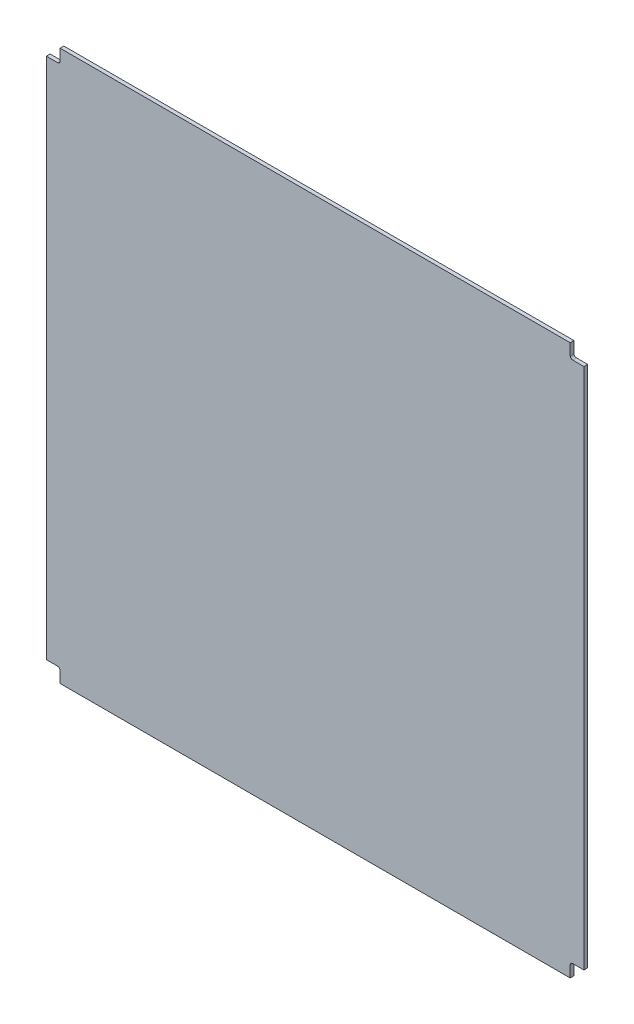
ISO-10303-21;
HEADER;
FILE_DESCRIPTION(('STEP AP214'),'2;1');
FILE_NAME('part.step','',(''),(''),'','','');
FILE_SCHEMA(('AUTOMOTIVE_DESIGN { 1 0 10303 214 1 1 1 1 }'));
ENDSEC;
DATA;
#1=APPLICATION_CONTEXT('core data for automotive mechanical design processes');
#2=APPLICATION_PROTOCOL_DEFINITION('international standard','automotive_design',2000,#1);
#3=PRODUCT_CONTEXT('',#1,'mechanical');
#4=PRODUCT('Part','Part','',(#3));
#5=PRODUCT_RELATED_PRODUCT_CATEGORY('part','',(#4));
#6=PRODUCT_DEFINITION_FORMATION('','',#4);
#7=PRODUCT_DEFINITION_CONTEXT('part definition',#1,'design');
#8=PRODUCT_DEFINITION('design','',#6,#7);
#9=PRODUCT_DEFINITION_SHAPE('','',#8);
#10=(LENGTH_UNIT() NAMED_UNIT(*) SI_UNIT(.MILLI.,.METRE.));
#11=(NAMED_UNIT(*) PLANE_ANGLE_UNIT() SI_UNIT($,.RADIAN.));
#12=(NAMED_UNIT(*) SI_UNIT($,.STERADIAN.) SOLID_ANGLE_UNIT());
#13=UNCERTAINTY_MEASURE_WITH_UNIT(LENGTH_MEASURE(1.E-05),#10,'distance_accuracy_value','');
#14=(GEOMETRIC_REPRESENTATION_CONTEXT(3) GLOBAL_UNCERTAINTY_ASSIGNED_CONTEXT((#13)) GLOBAL_UNIT_ASSIGNED_CONTEXT((#10,
#11,#12)) REPRESENTATION_CONTEXT('',''));
#15=CARTESIAN_POINT('',(0.,0.,0.));
#16=DIRECTION('',(0.,0.,1.));
#17=DIRECTION('',(1.,0.,0.));
#18=AXIS2_PLACEMENT_3D('',#15,#16,#17);
#19=CARTESIAN_POINT('',(0.,-209.,3.));
#20=DIRECTION('',(0.,1.,0.));
#21=DIRECTION('',(0.,0.,1.));
#22=AXIS2_PLACEMENT_3D('',#19,#20,#21);
#23=PLANE('',#22);
#24=DIRECTION('',(1.,0.,0.));
#25=VECTOR('',#24,1.);
#26=CARTESIAN_POINT('',(0.,-209.,0.));
#27=LINE('',#26,#25);
#28=CARTESIAN_POINT('',(-215.,-209.,0.));
#29=VERTEX_POINT('',#28);
#30=CARTESIAN_POINT('',(-206.,-209.,0.));
#31=VERTEX_POINT('',#30);
#32=EDGE_CURVE('E178',#29,#31,#27,.T.);
#33=ORIENTED_EDGE('',*,*,#32,.T.);
#34=DIRECTION('',(0.,0.,-1.));
#35=VECTOR('',#34,1.);
#36=CARTESIAN_POINT('',(-206.,-209.,3.));
#37=LINE('',#36,#35);
#38=CARTESIAN_POINT('',(-206.,-209.,3.));
#39=VERTEX_POINT('',#38);
#40=EDGE_CURVE('E11',#39,#31,#37,.T.);
#41=ORIENTED_EDGE('',*,*,#40,.F.);
#42=DIRECTION('',(1.,0.,0.));
#43=VECTOR('',#42,1.);
#44=CARTESIAN_POINT('',(0.,-209.,3.));
#45=LINE('',#44,#43);
#46=CARTESIAN_POINT('',(-215.,-209.,3.));
#47=VERTEX_POINT('',#46);
#48=EDGE_CURVE('E219',#47,#39,#45,.T.);
#49=ORIENTED_EDGE('',*,*,#48,.F.);
#50=DIRECTION('',(0.,0.,-1.));
#51=VECTOR('',#50,1.);
#52=CARTESIAN_POINT('',(-215.,-209.,3.));
#53=LINE('',#52,#51);
#54=EDGE_CURVE('E174',#47,#29,#53,.T.);
#55=ORIENTED_EDGE('',*,*,#54,.T.);
#56=EDGE_LOOP('',(#33,#41,#49,#55));
#57=FACE_BOUND('',#56,.T.);
#58=ADVANCED_FACE('F35',(#57),#23,.F.);
#59=CARTESIAN_POINT('',(-206.,-211.,3.));
#60=DIRECTION('',(0.,0.,-1.));
#61=DIRECTION('',(-1.,0.,0.));
#62=AXIS2_PLACEMENT_3D('',#59,#60,#61);
#63=CYLINDRICAL_SURFACE('',#62,2.00000000000002);
#64=CARTESIAN_POINT('',(-206.,-211.,0.));
#65=DIRECTION('',(0.,0.,1.));
#66=DIRECTION('',(1.,0.,0.));
#67=AXIS2_PLACEMENT_3D('',#64,#65,#66);
#68=CIRCLE('',#67,2.00000000000002);
#69=CARTESIAN_POINT('',(-204.,-211.,0.));
#70=VERTEX_POINT('',#69);
#71=EDGE_CURVE('E181',#31,#70,#68,.F.);
#72=ORIENTED_EDGE('',*,*,#71,.T.);
#73=DIRECTION('',(0.,0.,-1.));
#74=VECTOR('',#73,1.);
#75=CARTESIAN_POINT('',(-204.,-211.,3.));
#76=LINE('',#75,#74);
#77=CARTESIAN_POINT('',(-204.,-211.,3.));
#78=VERTEX_POINT('',#77);
#79=EDGE_CURVE('E43',#78,#70,#76,.T.);
#80=ORIENTED_EDGE('',*,*,#79,.F.);
#81=CARTESIAN_POINT('',(-206.,-211.,3.));
#82=DIRECTION('',(0.,0.,1.));
#83=DIRECTION('',(1.,0.,0.));
#84=AXIS2_PLACEMENT_3D('',#81,#82,#83);
#85=CIRCLE('',#84,2.00000000000002);
#86=EDGE_CURVE('E114',#39,#78,#85,.F.);
#87=ORIENTED_EDGE('',*,*,#86,.F.);
#88=ORIENTED_EDGE('',*,*,#40,.T.);
#89=EDGE_LOOP('',(#72,#80,#87,#88));
#90=FACE_BOUND('',#89,.T.);
#91=ADVANCED_FACE('F250',(#90),#63,.F.);
#92=CARTESIAN_POINT('',(-204.,0.,3.));
#93=DIRECTION('',(-1.,0.,0.));
#94=DIRECTION('',(0.,0.,1.));
#95=AXIS2_PLACEMENT_3D('',#92,#93,#94);
#96=PLANE('',#95);
#97=DIRECTION('',(0.,1.,0.));
#98=VECTOR('',#97,1.);
#99=CARTESIAN_POINT('',(-204.,0.,0.));
#100=LINE('',#99,#98);
#101=CARTESIAN_POINT('',(-204.,-220.,0.));
#102=VERTEX_POINT('',#101);
#103=EDGE_CURVE('E184',#102,#70,#100,.T.);
#104=ORIENTED_EDGE('',*,*,#103,.F.);
#105=DIRECTION('',(0.,0.,-1.));
#106=VECTOR('',#105,1.);
#107=CARTESIAN_POINT('',(-204.,-220.,3.));
#108=LINE('',#107,#106);
#109=CARTESIAN_POINT('',(-204.,-220.,3.));
#110=VERTEX_POINT('',#109);
#111=EDGE_CURVE('E243',#110,#102,#108,.T.);
#112=ORIENTED_EDGE('',*,*,#111,.F.);
#113=DIRECTION('',(0.,1.,0.));
#114=VECTOR('',#113,1.);
#115=CARTESIAN_POINT('',(-204.,0.,3.));
#116=LINE('',#115,#114);
#117=EDGE_CURVE('E249',#110,#78,#116,.T.);
#118=ORIENTED_EDGE('',*,*,#117,.T.);
#119=ORIENTED_EDGE('',*,*,#79,.T.);
#120=EDGE_LOOP('',(#104,#112,#118,#119));
#121=FACE_BOUND('',#120,.T.);
#122=ADVANCED_FACE('F247',(#121),#96,.T.);
#123=CARTESIAN_POINT('',(0.,-220.,3.));
#124=DIRECTION('',(0.,1.,0.));
#125=DIRECTION('',(-1.,0.,0.));
#126=AXIS2_PLACEMENT_3D('',#123,#124,#125);
#127=PLANE('',#126);
#128=DIRECTION('',(1.,0.,0.));
#129=VECTOR('',#128,1.);
#130=CARTESIAN_POINT('',(0.,-220.,0.));
#131=LINE('',#130,#129);
#132=CARTESIAN_POINT('',(204.,-220.,0.));
#133=VERTEX_POINT('',#132);
#134=EDGE_CURVE('E187',#102,#133,#131,.T.);
#135=ORIENTED_EDGE('',*,*,#134,.T.);
#136=DIRECTION('',(0.,0.,-1.));
#137=VECTOR('',#136,1.);
#138=CARTESIAN_POINT('',(204.,-220.,3.));
#139=LINE('',#138,#137);
#140=CARTESIAN_POINT('',(204.,-220.,3.));
#141=VERTEX_POINT('',#140);
#142=EDGE_CURVE('E240',#141,#133,#139,.T.);
#143=ORIENTED_EDGE('',*,*,#142,.F.);
#144=DIRECTION('',(1.,0.,0.));
#145=VECTOR('',#144,1.);
#146=CARTESIAN_POINT('',(0.,-220.,3.));
#147=LINE('',#146,#145);
#148=EDGE_CURVE('E269',#110,#141,#147,.T.);
#149=ORIENTED_EDGE('',*,*,#148,.F.);
#150=ORIENTED_EDGE('',*,*,#111,.T.);
#151=EDGE_LOOP('',(#135,#143,#149,#150));
#152=FACE_BOUND('',#151,.T.);
#153=ADVANCED_FACE('F259',(#152),#127,.F.);
#154=CARTESIAN_POINT('',(204.,0.,3.));
#155=DIRECTION('',(-1.,0.,0.));
#156=DIRECTION('',(0.,0.,1.));
#157=AXIS2_PLACEMENT_3D('',#154,#155,#156);
#158=PLANE('',#157);
#159=DIRECTION('',(0.,1.,0.));
#160=VECTOR('',#159,1.);
#161=CARTESIAN_POINT('',(204.,0.,0.));
#162=LINE('',#161,#160);
#163=CARTESIAN_POINT('',(204.,-211.,0.));
#164=VERTEX_POINT('',#163);
#165=EDGE_CURVE('E189',#133,#164,#162,.T.);
#166=ORIENTED_EDGE('',*,*,#165,.T.);
#167=DIRECTION('',(0.,0.,-1.));
#168=VECTOR('',#167,1.);
#169=CARTESIAN_POINT('',(204.,-211.,3.));
#170=LINE('',#169,#168);
#171=CARTESIAN_POINT('',(204.,-211.,3.));
#172=VERTEX_POINT('',#171);
#173=EDGE_CURVE('E238',#172,#164,#170,.T.);
#174=ORIENTED_EDGE('',*,*,#173,.F.);
#175=DIRECTION('',(0.,1.,0.));
#176=VECTOR('',#175,1.);
#177=CARTESIAN_POINT('',(204.,0.,3.));
#178=LINE('',#177,#176);
#179=EDGE_CURVE('E265',#141,#172,#178,.T.);
#180=ORIENTED_EDGE('',*,*,#179,.F.);
#181=ORIENTED_EDGE('',*,*,#142,.T.);
#182=EDGE_LOOP('',(#166,#174,#180,#181));
#183=FACE_BOUND('',#182,.T.);
#184=ADVANCED_FACE('F263',(#183),#158,.F.);
#185=CARTESIAN_POINT('',(206.,-211.,3.));
#186=DIRECTION('',(0.,0.,-1.));
#187=DIRECTION('',(-1.,0.,0.));
#188=AXIS2_PLACEMENT_3D('',#185,#186,#187);
#189=CYLINDRICAL_SURFACE('',#188,2.00000000000002);
#190=CARTESIAN_POINT('',(206.,-211.,0.));
#191=DIRECTION('',(0.,0.,1.));
#192=DIRECTION('',(1.,0.,0.));
#193=AXIS2_PLACEMENT_3D('',#190,#191,#192);
#194=CIRCLE('',#193,2.00000000000002);
#195=CARTESIAN_POINT('',(206.,-209.,0.));
#196=VERTEX_POINT('',#195);
#197=EDGE_CURVE('E192',#196,#164,#194,.T.);
#198=ORIENTED_EDGE('',*,*,#197,.F.);
#199=DIRECTION('',(0.,0.,-1.));
#200=VECTOR('',#199,1.);
#201=CARTESIAN_POINT('',(206.,-209.,3.));
#202=LINE('',#201,#200);
#203=CARTESIAN_POINT('',(206.,-209.,3.));
#204=VERTEX_POINT('',#203);
#205=EDGE_CURVE('E236',#204,#196,#202,.T.);
#206=ORIENTED_EDGE('',*,*,#205,.F.);
#207=CARTESIAN_POINT('',(206.,-211.,3.));
#208=DIRECTION('',(0.,0.,1.));
#209=DIRECTION('',(1.,0.,0.));
#210=AXIS2_PLACEMENT_3D('',#207,#208,#209);
#211=CIRCLE('',#210,2.00000000000002);
#212=EDGE_CURVE('E268',#204,#172,#211,.T.);
#213=ORIENTED_EDGE('',*,*,#212,.T.);
#214=ORIENTED_EDGE('',*,*,#173,.T.);
#215=EDGE_LOOP('',(#198,#206,#213,#214));
#216=FACE_BOUND('',#215,.T.);
#217=ADVANCED_FACE('F408',(#216),#189,.F.);
#218=CARTESIAN_POINT('',(0.,-209.,3.));
#219=DIRECTION('',(0.,-1.,0.));
#220=DIRECTION('',(0.,0.,-1.));
#221=AXIS2_PLACEMENT_3D('',#218,#219,#220);
#222=PLANE('',#221);
#223=DIRECTION('',(-1.,0.,0.));
#224=VECTOR('',#223,1.);
#225=CARTESIAN_POINT('',(0.,-209.,0.));
#226=LINE('',#225,#224);
#227=CARTESIAN_POINT('',(215.,-209.,0.));
#228=VERTEX_POINT('',#227);
#229=EDGE_CURVE('E195',#228,#196,#226,.T.);
#230=ORIENTED_EDGE('',*,*,#229,.F.);
#231=DIRECTION('',(0.,0.,-1.));
#232=VECTOR('',#231,1.);
#233=CARTESIAN_POINT('',(215.,-209.,3.));
#234=LINE('',#233,#232);
#235=CARTESIAN_POINT('',(215.,-209.,3.));
#236=VERTEX_POINT('',#235);
#237=EDGE_CURVE('E234',#236,#228,#234,.T.);
#238=ORIENTED_EDGE('',*,*,#237,.F.);
#239=DIRECTION('',(-1.,0.,0.));
#240=VECTOR('',#239,1.);
#241=CARTESIAN_POINT('',(0.,-209.,3.));
#242=LINE('',#241,#240);
#243=EDGE_CURVE('E271',#236,#204,#242,.T.);
#244=ORIENTED_EDGE('',*,*,#243,.T.);
#245=ORIENTED_EDGE('',*,*,#205,.T.);
#246=EDGE_LOOP('',(#230,#238,#244,#245));
#247=FACE_BOUND('',#246,.T.);
#248=ADVANCED_FACE('F398',(#247),#222,.T.);
#249=CARTESIAN_POINT('',(215.,0.,3.));
#250=DIRECTION('',(1.,0.,0.));
#251=DIRECTION('',(0.,1.,0.));
#252=AXIS2_PLACEMENT_3D('',#249,#250,#251);
#253=PLANE('',#252);
#254=DIRECTION('',(0.,-1.,0.));
#255=VECTOR('',#254,1.);
#256=CARTESIAN_POINT('',(215.,0.,0.));
#257=LINE('',#256,#255);
#258=CARTESIAN_POINT('',(215.,209.,0.));
#259=VERTEX_POINT('',#258);
#260=EDGE_CURVE('E198',#259,#228,#257,.T.);
#261=ORIENTED_EDGE('',*,*,#260,.F.);
#262=DIRECTION('',(0.,0.,-1.));
#263=VECTOR('',#262,1.);
#264=CARTESIAN_POINT('',(215.,209.,3.));
#265=LINE('',#264,#263);
#266=CARTESIAN_POINT('',(215.,209.,3.));
#267=VERTEX_POINT('',#266);
#268=EDGE_CURVE('E232',#267,#259,#265,.T.);
#269=ORIENTED_EDGE('',*,*,#268,.F.);
#270=DIRECTION('',(0.,-1.,0.));
#271=VECTOR('',#270,1.);
#272=CARTESIAN_POINT('',(215.,0.,3.));
#273=LINE('',#272,#271);
#274=EDGE_CURVE('E278',#267,#236,#273,.T.);
#275=ORIENTED_EDGE('',*,*,#274,.T.);
#276=ORIENTED_EDGE('',*,*,#237,.T.);
#277=EDGE_LOOP('',(#261,#269,#275,#276));
#278=FACE_BOUND('',#277,.T.);
#279=ADVANCED_FACE('F388',(#278),#253,.T.);
#280=CARTESIAN_POINT('',(0.,209.,3.));
#281=DIRECTION('',(0.,-1.,0.));
#282=DIRECTION('',(0.,0.,-1.));
#283=AXIS2_PLACEMENT_3D('',#280,#281,#282);
#284=PLANE('',#283);
#285=DIRECTION('',(-1.,0.,0.));
#286=VECTOR('',#285,1.);
#287=CARTESIAN_POINT('',(0.,209.,0.));
#288=LINE('',#287,#286);
#289=CARTESIAN_POINT('',(206.,209.,0.));
#290=VERTEX_POINT('',#289);
#291=EDGE_CURVE('E201',#259,#290,#288,.T.);
#292=ORIENTED_EDGE('',*,*,#291,.T.);
#293=DIRECTION('',(0.,0.,-1.));
#294=VECTOR('',#293,1.);
#295=CARTESIAN_POINT('',(206.,209.,3.));
#296=LINE('',#295,#294);
#297=CARTESIAN_POINT('',(206.,209.,3.));
#298=VERTEX_POINT('',#297);
#299=EDGE_CURVE('E229',#298,#290,#296,.T.);
#300=ORIENTED_EDGE('',*,*,#299,.F.);
#301=DIRECTION('',(-1.,0.,0.));
#302=VECTOR('',#301,1.);
#303=CARTESIAN_POINT('',(0.,209.,3.));
#304=LINE('',#303,#302);
#305=EDGE_CURVE('E281',#267,#298,#304,.T.);
#306=ORIENTED_EDGE('',*,*,#305,.F.);
#307=ORIENTED_EDGE('',*,*,#268,.T.);
#308=EDGE_LOOP('',(#292,#300,#306,#307));
#309=FACE_BOUND('',#308,.T.);
#310=ADVANCED_FACE('F378',(#309),#284,.F.);
#311=CARTESIAN_POINT('',(206.,211.,3.));
#312=DIRECTION('',(0.,0.,-1.));
#313=DIRECTION('',(-1.,0.,0.));
#314=AXIS2_PLACEMENT_3D('',#311,#312,#313);
#315=CYLINDRICAL_SURFACE('',#314,2.00000000000002);
#316=CARTESIAN_POINT('',(206.,211.,0.));
#317=DIRECTION('',(0.,0.,1.));
#318=DIRECTION('',(1.,0.,0.));
#319=AXIS2_PLACEMENT_3D('',#316,#317,#318);
#320=CIRCLE('',#319,2.00000000000002);
#321=CARTESIAN_POINT('',(204.,211.,0.));
#322=VERTEX_POINT('',#321);
#323=EDGE_CURVE('E203',#290,#322,#320,.F.);
#324=ORIENTED_EDGE('',*,*,#323,.T.);
#325=DIRECTION('',(0.,0.,-1.));
#326=VECTOR('',#325,1.);
#327=CARTESIAN_POINT('',(204.,211.,3.));
#328=LINE('',#327,#326);
#329=CARTESIAN_POINT('',(204.,211.,3.));
#330=VERTEX_POINT('',#329);
#331=EDGE_CURVE('E227',#330,#322,#328,.T.);
#332=ORIENTED_EDGE('',*,*,#331,.F.);
#333=CARTESIAN_POINT('',(206.,211.,3.));
#334=DIRECTION('',(0.,0.,1.));
#335=DIRECTION('',(1.,0.,0.));
#336=AXIS2_PLACEMENT_3D('',#333,#334,#335);
#337=CIRCLE('',#336,2.00000000000002);
#338=EDGE_CURVE('E283',#298,#330,#337,.F.);
#339=ORIENTED_EDGE('',*,*,#338,.F.);
#340=ORIENTED_EDGE('',*,*,#299,.T.);
#341=EDGE_LOOP('',(#324,#332,#339,#340));
#342=FACE_BOUND('',#341,.T.);
#343=ADVANCED_FACE('F369',(#342),#315,.F.);
#344=CARTESIAN_POINT('',(204.,0.,3.));
#345=DIRECTION('',(1.,0.,0.));
#346=DIRECTION('',(0.,0.,-1.));
#347=AXIS2_PLACEMENT_3D('',#344,#345,#346);
#348=PLANE('',#347);
#349=DIRECTION('',(0.,-1.,0.));
#350=VECTOR('',#349,1.);
#351=CARTESIAN_POINT('',(204.,0.,0.));
#352=LINE('',#351,#350);
#353=CARTESIAN_POINT('',(204.,220.,0.));
#354=VERTEX_POINT('',#353);
#355=EDGE_CURVE('E206',#354,#322,#352,.T.);
#356=ORIENTED_EDGE('',*,*,#355,.F.);
#357=DIRECTION('',(0.,0.,-1.));
#358=VECTOR('',#357,1.);
#359=CARTESIAN_POINT('',(204.,220.,3.));
#360=LINE('',#359,#358);
#361=CARTESIAN_POINT('',(204.,220.,3.));
#362=VERTEX_POINT('',#361);
#363=EDGE_CURVE('E225',#362,#354,#360,.T.);
#364=ORIENTED_EDGE('',*,*,#363,.F.);
#365=DIRECTION('',(0.,-1.,0.));
#366=VECTOR('',#365,1.);
#367=CARTESIAN_POINT('',(204.,0.,3.));
#368=LINE('',#367,#366);
#369=EDGE_CURVE('E285',#362,#330,#368,.T.);
#370=ORIENTED_EDGE('',*,*,#369,.T.);
#371=ORIENTED_EDGE('',*,*,#331,.T.);
#372=EDGE_LOOP('',(#356,#364,#370,#371));
#373=FACE_BOUND('',#372,.T.);
#374=ADVANCED_FACE('F298',(#373),#348,.T.);
#375=CARTESIAN_POINT('',(0.,220.,3.));
#376=DIRECTION('',(0.,1.,0.));
#377=DIRECTION('',(-1.,0.,0.));
#378=AXIS2_PLACEMENT_3D('',#375,#376,#377);
#379=PLANE('',#378);
#380=DIRECTION('',(1.,0.,0.));
#381=VECTOR('',#380,1.);
#382=CARTESIAN_POINT('',(0.,220.,0.));
#383=LINE('',#382,#381);
#384=CARTESIAN_POINT('',(-204.,220.,0.));
#385=VERTEX_POINT('',#384);
#386=EDGE_CURVE('E209',#385,#354,#383,.T.);
#387=ORIENTED_EDGE('',*,*,#386,.F.);
#388=DIRECTION('',(0.,0.,-1.));
#389=VECTOR('',#388,1.);
#390=CARTESIAN_POINT('',(-204.,220.,3.));
#391=LINE('',#390,#389);
#392=CARTESIAN_POINT('',(-204.,220.,3.));
#393=VERTEX_POINT('',#392);
#394=EDGE_CURVE('E223',#393,#385,#391,.T.);
#395=ORIENTED_EDGE('',*,*,#394,.F.);
#396=DIRECTION('',(1.,0.,0.));
#397=VECTOR('',#396,1.);
#398=CARTESIAN_POINT('',(0.,220.,3.));
#399=LINE('',#398,#397);
#400=EDGE_CURVE('E288',#393,#362,#399,.T.);
#401=ORIENTED_EDGE('',*,*,#400,.T.);
#402=ORIENTED_EDGE('',*,*,#363,.T.);
#403=EDGE_LOOP('',(#387,#395,#401,#402));
#404=FACE_BOUND('',#403,.T.);
#405=ADVANCED_FACE('F292',(#404),#379,.T.);
#406=CARTESIAN_POINT('',(-204.,0.,3.));
#407=DIRECTION('',(1.,0.,0.));
#408=DIRECTION('',(0.,0.,-1.));
#409=AXIS2_PLACEMENT_3D('',#406,#407,#408);
#410=PLANE('',#409);
#411=DIRECTION('',(0.,-1.,0.));
#412=VECTOR('',#411,1.);
#413=CARTESIAN_POINT('',(-204.,0.,0.));
#414=LINE('',#413,#412);
#415=CARTESIAN_POINT('',(-204.,211.,0.));
#416=VERTEX_POINT('',#415);
#417=EDGE_CURVE('E212',#385,#416,#414,.T.);
#418=ORIENTED_EDGE('',*,*,#417,.T.);
#419=DIRECTION('',(0.,0.,-1.));
#420=VECTOR('',#419,1.);
#421=CARTESIAN_POINT('',(-204.,211.,3.));
#422=LINE('',#421,#420);
#423=CARTESIAN_POINT('',(-204.,211.,3.));
#424=VERTEX_POINT('',#423);
#425=EDGE_CURVE('E163',#424,#416,#422,.T.);
#426=ORIENTED_EDGE('',*,*,#425,.F.);
#427=DIRECTION('',(0.,-1.,0.));
#428=VECTOR('',#427,1.);
#429=CARTESIAN_POINT('',(-204.,0.,3.));
#430=LINE('',#429,#428);
#431=EDGE_CURVE('E169',#393,#424,#430,.T.);
#432=ORIENTED_EDGE('',*,*,#431,.F.);
#433=ORIENTED_EDGE('',*,*,#394,.T.);
#434=EDGE_LOOP('',(#418,#426,#432,#433));
#435=FACE_BOUND('',#434,.T.);
#436=ADVANCED_FACE('F302',(#435),#410,.F.);
#437=CARTESIAN_POINT('',(-206.,211.,3.));
#438=DIRECTION('',(0.,0.,-1.));
#439=DIRECTION('',(-1.,0.,0.));
#440=AXIS2_PLACEMENT_3D('',#437,#438,#439);
#441=CYLINDRICAL_SURFACE('',#440,2.00000000000002);
#442=CARTESIAN_POINT('',(-206.,211.,0.));
#443=DIRECTION('',(0.,0.,1.));
#444=DIRECTION('',(1.,0.,0.));
#445=AXIS2_PLACEMENT_3D('',#442,#443,#444);
#446=CIRCLE('',#445,2.00000000000002);
#447=CARTESIAN_POINT('',(-206.,209.,0.));
#448=VERTEX_POINT('',#447);
#449=EDGE_CURVE('E158',#448,#416,#446,.T.);
#450=ORIENTED_EDGE('',*,*,#449,.F.);
#451=DIRECTION('',(0.,0.,-1.));
#452=VECTOR('',#451,1.);
#453=CARTESIAN_POINT('',(-206.,209.,3.));
#454=LINE('',#453,#452);
#455=CARTESIAN_POINT('',(-206.,209.,3.));
#456=VERTEX_POINT('',#455);
#457=EDGE_CURVE('E153',#456,#448,#454,.T.);
#458=ORIENTED_EDGE('',*,*,#457,.F.);
#459=CARTESIAN_POINT('',(-206.,211.,3.));
#460=DIRECTION('',(0.,0.,1.));
#461=DIRECTION('',(1.,0.,0.));
#462=AXIS2_PLACEMENT_3D('',#459,#460,#461);
#463=CIRCLE('',#462,2.00000000000002);
#464=EDGE_CURVE('E156',#456,#424,#463,.T.);
#465=ORIENTED_EDGE('',*,*,#464,.T.);
#466=ORIENTED_EDGE('',*,*,#425,.T.);
#467=EDGE_LOOP('',(#450,#458,#465,#466));
#468=FACE_BOUND('',#467,.T.);
#469=ADVANCED_FACE('F155',(#468),#441,.F.);
#470=CARTESIAN_POINT('',(0.,209.,3.));
#471=DIRECTION('',(0.,1.,0.));
#472=DIRECTION('',(0.,0.,1.));
#473=AXIS2_PLACEMENT_3D('',#470,#471,#472);
#474=PLANE('',#473);
#475=DIRECTION('',(1.,0.,0.));
#476=VECTOR('',#475,1.);
#477=CARTESIAN_POINT('',(0.,209.,0.));
#478=LINE('',#477,#476);
#479=CARTESIAN_POINT('',(-215.,209.,0.));
#480=VERTEX_POINT('',#479);
#481=EDGE_CURVE('E216',#480,#448,#478,.T.);
#482=ORIENTED_EDGE('',*,*,#481,.F.);
#483=DIRECTION('',(0.,0.,-1.));
#484=VECTOR('',#483,1.);
#485=CARTESIAN_POINT('',(-215.,209.,3.));
#486=LINE('',#485,#484);
#487=CARTESIAN_POINT('',(-215.,209.,3.));
#488=VERTEX_POINT('',#487);
#489=EDGE_CURVE('E103',#488,#480,#486,.T.);
#490=ORIENTED_EDGE('',*,*,#489,.F.);
#491=DIRECTION('',(1.,0.,0.));
#492=VECTOR('',#491,1.);
#493=CARTESIAN_POINT('',(0.,209.,3.));
#494=LINE('',#493,#492);
#495=EDGE_CURVE('E166',#488,#456,#494,.T.);
#496=ORIENTED_EDGE('',*,*,#495,.T.);
#497=ORIENTED_EDGE('',*,*,#457,.T.);
#498=EDGE_LOOP('',(#482,#490,#496,#497));
#499=FACE_BOUND('',#498,.T.);
#500=ADVANCED_FACE('F172',(#499),#474,.T.);
#501=CARTESIAN_POINT('',(-215.,0.,3.));
#502=DIRECTION('',(1.,0.,0.));
#503=DIRECTION('',(0.,1.,0.));
#504=AXIS2_PLACEMENT_3D('',#501,#502,#503);
#505=PLANE('',#504);
#506=DIRECTION('',(0.,-1.,0.));
#507=VECTOR('',#506,1.);
#508=CARTESIAN_POINT('',(-215.,0.,0.));
#509=LINE('',#508,#507);
#510=EDGE_CURVE('E106',#480,#29,#509,.T.);
#511=ORIENTED_EDGE('',*,*,#510,.T.);
#512=ORIENTED_EDGE('',*,*,#54,.F.);
#513=DIRECTION('',(0.,-1.,0.));
#514=VECTOR('',#513,1.);
#515=CARTESIAN_POINT('',(-215.,0.,3.));
#516=LINE('',#515,#514);
#517=EDGE_CURVE('E51',#488,#47,#516,.T.);
#518=ORIENTED_EDGE('',*,*,#517,.F.);
#519=ORIENTED_EDGE('',*,*,#489,.T.);
#520=EDGE_LOOP('',(#511,#512,#518,#519));
#521=FACE_BOUND('',#520,.T.);
#522=ADVANCED_FACE('F317',(#521),#505,.F.);
#523=CARTESIAN_POINT('',(0.,0.,3.));
#524=DIRECTION('',(0.,0.,1.));
#525=DIRECTION('',(1.,0.,0.));
#526=AXIS2_PLACEMENT_3D('',#523,#524,#525);
#527=PLANE('',#526);
#528=ORIENTED_EDGE('',*,*,#48,.T.);
#529=ORIENTED_EDGE('',*,*,#86,.T.);
#530=ORIENTED_EDGE('',*,*,#117,.F.);
#531=ORIENTED_EDGE('',*,*,#148,.T.);
#532=ORIENTED_EDGE('',*,*,#179,.T.);
#533=ORIENTED_EDGE('',*,*,#212,.F.);
#534=ORIENTED_EDGE('',*,*,#243,.F.);
#535=ORIENTED_EDGE('',*,*,#274,.F.);
#536=ORIENTED_EDGE('',*,*,#305,.T.);
#537=ORIENTED_EDGE('',*,*,#338,.T.);
#538=ORIENTED_EDGE('',*,*,#369,.F.);
#539=ORIENTED_EDGE('',*,*,#400,.F.);
#540=ORIENTED_EDGE('',*,*,#431,.T.);
#541=ORIENTED_EDGE('',*,*,#464,.F.);
#542=ORIENTED_EDGE('',*,*,#495,.F.);
#543=ORIENTED_EDGE('',*,*,#517,.T.);
#544=EDGE_LOOP('',(#528,#529,#530,#531,#532,#533,#534,#535,#536,#537,#538,#539,#540,#541,#542,#543));
#545=FACE_BOUND('',#544,.T.);
#546=ADVANCED_FACE('F165',(#545),#527,.T.);
#547=CARTESIAN_POINT('',(0.,0.,0.));
#548=DIRECTION('',(0.,0.,1.));
#549=DIRECTION('',(1.,0.,0.));
#550=AXIS2_PLACEMENT_3D('',#547,#548,#549);
#551=PLANE('',#550);
#552=ORIENTED_EDGE('',*,*,#32,.F.);
#553=ORIENTED_EDGE('',*,*,#510,.F.);
#554=ORIENTED_EDGE('',*,*,#481,.T.);
#555=ORIENTED_EDGE('',*,*,#449,.T.);
#556=ORIENTED_EDGE('',*,*,#417,.F.);
#557=ORIENTED_EDGE('',*,*,#386,.T.);
#558=ORIENTED_EDGE('',*,*,#355,.T.);
#559=ORIENTED_EDGE('',*,*,#323,.F.);
#560=ORIENTED_EDGE('',*,*,#291,.F.);
#561=ORIENTED_EDGE('',*,*,#260,.T.);
#562=ORIENTED_EDGE('',*,*,#229,.T.);
#563=ORIENTED_EDGE('',*,*,#197,.T.);
#564=ORIENTED_EDGE('',*,*,#165,.F.);
#565=ORIENTED_EDGE('',*,*,#134,.F.);
#566=ORIENTED_EDGE('',*,*,#103,.T.);
#567=ORIENTED_EDGE('',*,*,#71,.F.);
#568=EDGE_LOOP('',(#552,#553,#554,#555,#556,#557,#558,#559,#560,#561,#562,#563,#564,#565,#566,#567));
#569=FACE_BOUND('',#568,.T.);
#570=ADVANCED_FACE('F255',(#569),#551,.F.);
#571=CLOSED_SHELL('',(#58,#91,#122,#153,#184,#217,#248,#279,#310,#343,#374,#405,#436,#469,#500,
#522,#546,#570));
#572=MANIFOLD_SOLID_BREP('B2',#571);
#573=ADVANCED_BREP_SHAPE_REPRESENTATION('',(#18,#572),#14);
#574=SHAPE_DEFINITION_REPRESENTATION(#9,#573);
ENDSEC;
END-ISO-10303-21;
